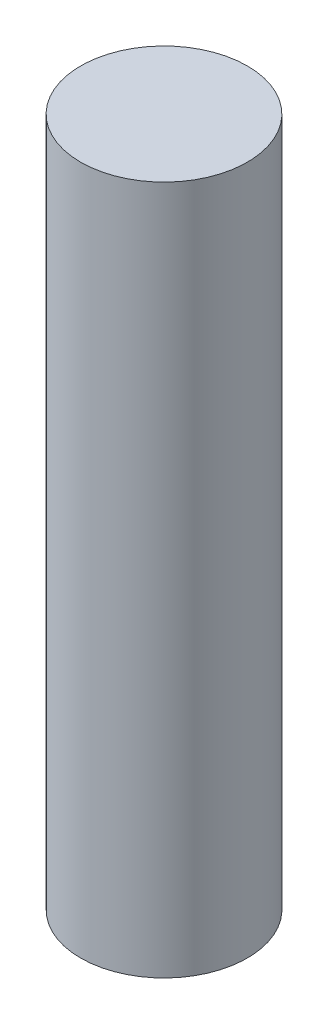
ISO-10303-21;
HEADER;
FILE_DESCRIPTION(('STEP AP214'),'2;1');
FILE_NAME('part.step','',(''),(''),'','','');
FILE_SCHEMA(('AUTOMOTIVE_DESIGN { 1 0 10303 214 1 1 1 1 }'));
ENDSEC;
DATA;
#1=APPLICATION_CONTEXT('core data for automotive mechanical design processes');
#2=APPLICATION_PROTOCOL_DEFINITION('international standard','automotive_design',2000,#1);
#3=PRODUCT_CONTEXT('',#1,'mechanical');
#4=PRODUCT('Part','Part','',(#3));
#5=PRODUCT_RELATED_PRODUCT_CATEGORY('part','',(#4));
#6=PRODUCT_DEFINITION_FORMATION('','',#4);
#7=PRODUCT_DEFINITION_CONTEXT('part definition',#1,'design');
#8=PRODUCT_DEFINITION('design','',#6,#7);
#9=PRODUCT_DEFINITION_SHAPE('','',#8);
#10=(LENGTH_UNIT() NAMED_UNIT(*) SI_UNIT(.MILLI.,.METRE.));
#11=(NAMED_UNIT(*) PLANE_ANGLE_UNIT() SI_UNIT($,.RADIAN.));
#12=(NAMED_UNIT(*) SI_UNIT($,.STERADIAN.) SOLID_ANGLE_UNIT());
#13=UNCERTAINTY_MEASURE_WITH_UNIT(LENGTH_MEASURE(1.E-05),#10,'distance_accuracy_value','');
#14=(GEOMETRIC_REPRESENTATION_CONTEXT(3) GLOBAL_UNCERTAINTY_ASSIGNED_CONTEXT((#13)) GLOBAL_UNIT_ASSIGNED_CONTEXT((#10,
#11,#12)) REPRESENTATION_CONTEXT('',''));
#15=CARTESIAN_POINT('',(0.,0.,0.));
#16=DIRECTION('',(0.,0.,1.));
#17=DIRECTION('',(1.,0.,0.));
#18=AXIS2_PLACEMENT_3D('',#15,#16,#17);
#19=CARTESIAN_POINT('',(0.,12.4,0.));
#20=DIRECTION('',(0.,-1.,0.));
#21=DIRECTION('',(0.,0.,-1.));
#22=AXIS2_PLACEMENT_3D('',#19,#20,#21);
#23=CYLINDRICAL_SURFACE('',#22,1.5);
#24=CARTESIAN_POINT('',(0.,12.4,0.));
#25=DIRECTION('',(0.,1.,0.));
#26=DIRECTION('',(0.,0.,1.));
#27=AXIS2_PLACEMENT_3D('',#24,#25,#26);
#28=CIRCLE('',#27,1.5);
#29=CARTESIAN_POINT('',(0.,12.4,-1.5));
#30=VERTEX_POINT('',#29);
#31=EDGE_CURVE('E10',#30,#30,#28,.T.);
#32=CARTESIAN_POINT('',(0.,0.,0.));
#33=DIRECTION('',(0.,1.,0.));
#34=DIRECTION('',(0.,0.,1.));
#35=AXIS2_PLACEMENT_3D('',#32,#33,#34);
#36=CIRCLE('',#35,1.5);
#37=CARTESIAN_POINT('',(0.,0.,-1.5));
#38=VERTEX_POINT('',#37);
#39=EDGE_CURVE('E40',#38,#38,#36,.T.);
#40=CARTESIAN_POINT('',(0.,12.4,-1.5));
#41=CARTESIAN_POINT('',(0.,12.2708333333333,-1.5));
#42=CARTESIAN_POINT('',(0.,12.1416666666667,-1.5));
#43=CARTESIAN_POINT('',(0.,11.8833333333333,-1.5));
#44=CARTESIAN_POINT('',(0.,11.7541666666667,-1.5));
#45=CARTESIAN_POINT('',(0.,11.4958333333333,-1.5));
#46=CARTESIAN_POINT('',(0.,11.3666666666667,-1.5));
#47=CARTESIAN_POINT('',(0.,11.1083333333333,-1.5));
#48=CARTESIAN_POINT('',(0.,10.9791666666667,-1.5));
#49=CARTESIAN_POINT('',(0.,10.7208333333333,-1.5));
#50=CARTESIAN_POINT('',(0.,10.5916666666667,-1.5));
#51=CARTESIAN_POINT('',(0.,10.3333333333333,-1.5));
#52=CARTESIAN_POINT('',(0.,10.2041666666667,-1.5));
#53=CARTESIAN_POINT('',(0.,9.94583333333333,-1.5));
#54=CARTESIAN_POINT('',(0.,9.81666666666666,-1.5));
#55=CARTESIAN_POINT('',(0.,9.55833333333333,-1.5));
#56=CARTESIAN_POINT('',(0.,9.42916666666667,-1.5));
#57=CARTESIAN_POINT('',(0.,9.17083333333333,-1.5));
#58=CARTESIAN_POINT('',(0.,9.04166666666666,-1.5));
#59=CARTESIAN_POINT('',(0.,8.78333333333333,-1.5));
#60=CARTESIAN_POINT('',(0.,8.65416666666667,-1.5));
#61=CARTESIAN_POINT('',(0.,8.39583333333333,-1.5));
#62=CARTESIAN_POINT('',(0.,8.26666666666667,-1.5));
#63=CARTESIAN_POINT('',(0.,8.00833333333333,-1.5));
#64=CARTESIAN_POINT('',(0.,7.87916666666667,-1.5));
#65=CARTESIAN_POINT('',(0.,7.62083333333333,-1.5));
#66=CARTESIAN_POINT('',(0.,7.49166666666667,-1.5));
#67=CARTESIAN_POINT('',(0.,7.23333333333333,-1.5));
#68=CARTESIAN_POINT('',(0.,7.10416666666667,-1.5));
#69=CARTESIAN_POINT('',(0.,6.84583333333333,-1.5));
#70=CARTESIAN_POINT('',(0.,6.71666666666667,-1.5));
#71=CARTESIAN_POINT('',(0.,6.45833333333333,-1.5));
#72=CARTESIAN_POINT('',(0.,6.32916666666666,-1.5));
#73=CARTESIAN_POINT('',(0.,6.07083333333333,-1.5));
#74=CARTESIAN_POINT('',(0.,5.94166666666667,-1.5));
#75=CARTESIAN_POINT('',(0.,5.68333333333333,-1.5));
#76=CARTESIAN_POINT('',(0.,5.55416666666667,-1.5));
#77=CARTESIAN_POINT('',(0.,5.29583333333333,-1.5));
#78=CARTESIAN_POINT('',(0.,5.16666666666667,-1.5));
#79=CARTESIAN_POINT('',(0.,4.90833333333333,-1.5));
#80=CARTESIAN_POINT('',(0.,4.77916666666667,-1.5));
#81=CARTESIAN_POINT('',(0.,4.52083333333333,-1.5));
#82=CARTESIAN_POINT('',(0.,4.39166666666667,-1.5));
#83=CARTESIAN_POINT('',(0.,4.13333333333333,-1.5));
#84=CARTESIAN_POINT('',(0.,4.00416666666667,-1.5));
#85=CARTESIAN_POINT('',(0.,3.74583333333333,-1.5));
#86=CARTESIAN_POINT('',(0.,3.61666666666667,-1.5));
#87=CARTESIAN_POINT('',(0.,3.35833333333333,-1.5));
#88=CARTESIAN_POINT('',(0.,3.22916666666667,-1.5));
#89=CARTESIAN_POINT('',(0.,2.97083333333333,-1.5));
#90=CARTESIAN_POINT('',(0.,2.84166666666667,-1.5));
#91=CARTESIAN_POINT('',(0.,2.58333333333333,-1.5));
#92=CARTESIAN_POINT('',(0.,2.45416666666667,-1.5));
#93=CARTESIAN_POINT('',(0.,2.19583333333333,-1.5));
#94=CARTESIAN_POINT('',(0.,2.06666666666667,-1.5));
#95=CARTESIAN_POINT('',(0.,1.80833333333333,-1.5));
#96=CARTESIAN_POINT('',(0.,1.67916666666667,-1.5));
#97=CARTESIAN_POINT('',(0.,1.42083333333333,-1.5));
#98=CARTESIAN_POINT('',(0.,1.29166666666667,-1.5));
#99=CARTESIAN_POINT('',(0.,1.03333333333333,-1.5));
#100=CARTESIAN_POINT('',(0.,0.904166666666667,-1.5));
#101=CARTESIAN_POINT('',(0.,0.645833333333333,-1.5));
#102=CARTESIAN_POINT('',(0.,0.516666666666667,-1.5));
#103=CARTESIAN_POINT('',(0.,0.258333333333334,-1.5));
#104=CARTESIAN_POINT('',(0.,0.129166666666667,-1.5));
#105=CARTESIAN_POINT('',(0.,0.,-1.5));
#106=B_SPLINE_CURVE_WITH_KNOTS('',3,(#40,#41,#42,#43,#44,#45,#46,#47,#48,#49,#50,#51,#52,#53,
#54,#55,#56,#57,#58,#59,#60,#61,#62,#63,#64,#65,#66,#67,#68,#69,#70,#71,#72,#73,#74,#75,#76,#77,
#78,#79,#80,#81,#82,#83,#84,#85,#86,#87,#88,#89,#90,#91,#92,#93,#94,#95,#96,#97,#98,#99,#100,
#101,#102,#103,#104,#105),.UNSPECIFIED.,.F.,.F.,(4,2,2,2,2,2,2,2,2,2,2,2,2,2,2,2,2,2,2,2,2,2,2,
2,2,2,2,2,2,2,2,2,4),(0.,0.387500000000001,0.775000000000001,1.1625,1.55,1.9375,2.325,2.7125,
3.1,3.4875,3.875,4.2625,4.65,5.0375,5.425,5.8125,6.2,6.5875,6.975,7.3625,7.75,8.1375,8.525,
8.9125,9.3,9.6875,10.075,10.4625,10.85,11.2375,11.625,12.0125,12.4),.UNSPECIFIED.);
#107=EDGE_CURVE('BSEAM37',#30,#38,#106,.T.);
#108=ORIENTED_EDGE('',*,*,#31,.F.);
#109=ORIENTED_EDGE('',*,*,#39,.T.);
#110=ORIENTED_EDGE('',*,*,#107,.T.);
#111=ORIENTED_EDGE('',*,*,#107,.F.);
#112=EDGE_LOOP('',(#108,#110,#109,#111));
#113=FACE_BOUND('',#112,.T.);
#114=ADVANCED_FACE('F37',(#113),#23,.T.);
#115=CARTESIAN_POINT('',(0.,12.4,0.));
#116=DIRECTION('',(0.,1.,0.));
#117=DIRECTION('',(0.,0.,1.));
#118=AXIS2_PLACEMENT_3D('',#115,#116,#117);
#119=PLANE('',#118);
#120=ORIENTED_EDGE('',*,*,#31,.T.);
#121=EDGE_LOOP('',(#120));
#122=FACE_BOUND('',#121,.T.);
#123=ADVANCED_FACE('F54',(#122),#119,.T.);
#124=CARTESIAN_POINT('',(0.,0.,0.));
#125=DIRECTION('',(0.,1.,0.));
#126=DIRECTION('',(0.,0.,1.));
#127=AXIS2_PLACEMENT_3D('',#124,#125,#126);
#128=PLANE('',#127);
#129=ORIENTED_EDGE('',*,*,#39,.F.);
#130=EDGE_LOOP('',(#129));
#131=FACE_BOUND('',#130,.T.);
#132=ADVANCED_FACE('F52',(#131),#128,.F.);
#133=CLOSED_SHELL('',(#114,#123,#132));
#134=MANIFOLD_SOLID_BREP('B2',#133);
#135=ADVANCED_BREP_SHAPE_REPRESENTATION('',(#18,#134),#14);
#136=SHAPE_DEFINITION_REPRESENTATION(#9,#135);
ENDSEC;
END-ISO-10303-21;
